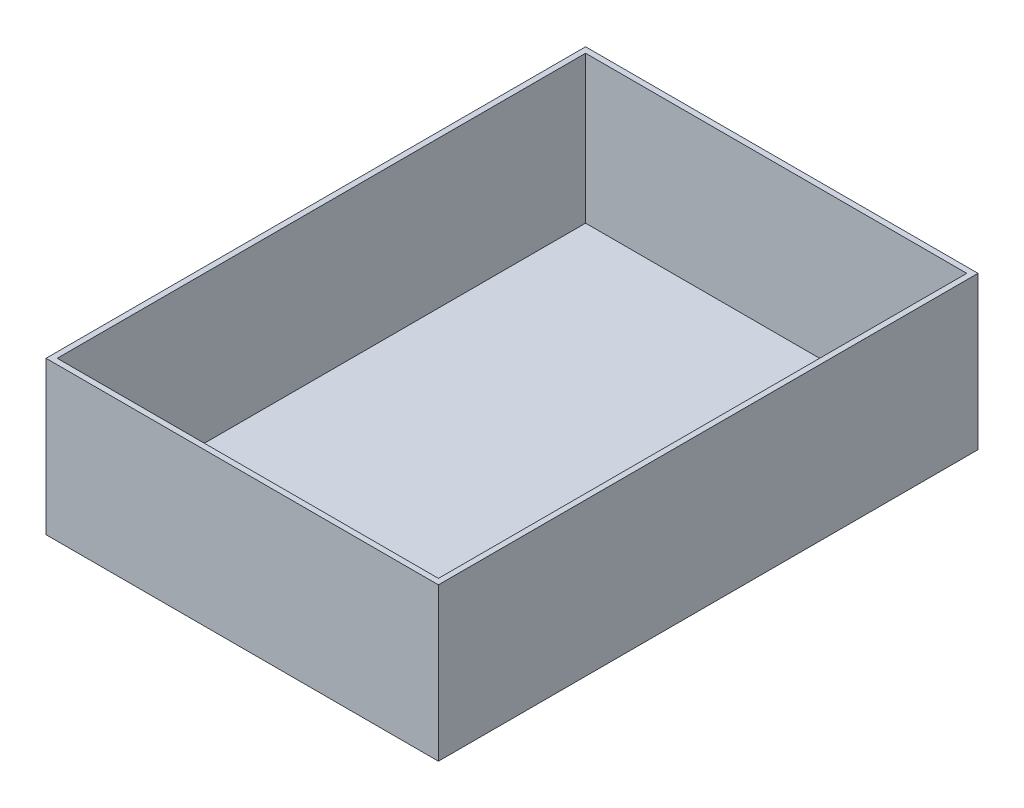
ISO-10303-21;
HEADER;
FILE_DESCRIPTION(('STEP AP214'),'2;1');
FILE_NAME('part.step','',(''),(''),'','','');
FILE_SCHEMA(('AUTOMOTIVE_DESIGN { 1 0 10303 214 1 1 1 1 }'));
ENDSEC;
DATA;
#1=APPLICATION_CONTEXT('core data for automotive mechanical design processes');
#2=APPLICATION_PROTOCOL_DEFINITION('international standard','automotive_design',2000,#1);
#3=PRODUCT_CONTEXT('',#1,'mechanical');
#4=PRODUCT('Part','Part','',(#3));
#5=PRODUCT_RELATED_PRODUCT_CATEGORY('part','',(#4));
#6=PRODUCT_DEFINITION_FORMATION('','',#4);
#7=PRODUCT_DEFINITION_CONTEXT('part definition',#1,'design');
#8=PRODUCT_DEFINITION('design','',#6,#7);
#9=PRODUCT_DEFINITION_SHAPE('','',#8);
#10=(LENGTH_UNIT() NAMED_UNIT(*) SI_UNIT(.MILLI.,.METRE.));
#11=(NAMED_UNIT(*) PLANE_ANGLE_UNIT() SI_UNIT($,.RADIAN.));
#12=(NAMED_UNIT(*) SI_UNIT($,.STERADIAN.) SOLID_ANGLE_UNIT());
#13=UNCERTAINTY_MEASURE_WITH_UNIT(LENGTH_MEASURE(1.E-05),#10,'distance_accuracy_value','');
#14=(GEOMETRIC_REPRESENTATION_CONTEXT(3) GLOBAL_UNCERTAINTY_ASSIGNED_CONTEXT((#13)) GLOBAL_UNIT_ASSIGNED_CONTEXT((#10,
#11,#12)) REPRESENTATION_CONTEXT('',''));
#15=CARTESIAN_POINT('',(0.,0.,0.));
#16=DIRECTION('',(0.,0.,1.));
#17=DIRECTION('',(1.,0.,0.));
#18=AXIS2_PLACEMENT_3D('',#15,#16,#17);
#19=CARTESIAN_POINT('',(0.,21.8,0.));
#20=DIRECTION('',(0.,-1.,0.));
#21=DIRECTION('',(0.,0.,-1.));
#22=AXIS2_PLACEMENT_3D('',#19,#20,#21);
#23=PLANE('',#22);
#24=DIRECTION('',(0.,0.,-1.));
#25=VECTOR('',#24,1.);
#26=CARTESIAN_POINT('',(28.,21.8,38.5));
#27=LINE('',#26,#25);
#28=CARTESIAN_POINT('',(28.,21.8,38.5));
#29=VERTEX_POINT('',#28);
#30=CARTESIAN_POINT('',(28.,21.8,-38.5));
#31=VERTEX_POINT('',#30);
#32=EDGE_CURVE('E159',#29,#31,#27,.T.);
#33=ORIENTED_EDGE('',*,*,#32,.T.);
#34=DIRECTION('',(-1.,0.,0.));
#35=VECTOR('',#34,1.);
#36=CARTESIAN_POINT('',(-28.,21.8,-38.5));
#37=LINE('',#36,#35);
#38=CARTESIAN_POINT('',(-28.,21.8,-38.5));
#39=VERTEX_POINT('',#38);
#40=EDGE_CURVE('E94',#31,#39,#37,.T.);
#41=ORIENTED_EDGE('',*,*,#40,.T.);
#42=DIRECTION('',(0.,0.,1.));
#43=VECTOR('',#42,1.);
#44=CARTESIAN_POINT('',(-28.,21.8,38.5));
#45=LINE('',#44,#43);
#46=CARTESIAN_POINT('',(-28.,21.8,38.5));
#47=VERTEX_POINT('',#46);
#48=EDGE_CURVE('E164',#39,#47,#45,.T.);
#49=ORIENTED_EDGE('',*,*,#48,.T.);
#50=DIRECTION('',(1.,0.,0.));
#51=VECTOR('',#50,1.);
#52=CARTESIAN_POINT('',(-28.,21.8,38.5));
#53=LINE('',#52,#51);
#54=EDGE_CURVE('E66',#47,#29,#53,.T.);
#55=ORIENTED_EDGE('',*,*,#54,.T.);
#56=EDGE_LOOP('',(#33,#41,#49,#55));
#57=FACE_BOUND('',#56,.T.);
#58=DIRECTION('',(0.,0.,-1.));
#59=VECTOR('',#58,1.);
#60=CARTESIAN_POINT('',(27.2,21.8,0.));
#61=LINE('',#60,#59);
#62=CARTESIAN_POINT('',(27.2,21.8,37.7));
#63=VERTEX_POINT('',#62);
#64=CARTESIAN_POINT('',(27.2,21.8,-37.7));
#65=VERTEX_POINT('',#64);
#66=EDGE_CURVE('E143',#63,#65,#61,.T.);
#67=ORIENTED_EDGE('',*,*,#66,.F.);
#68=DIRECTION('',(1.,0.,0.));
#69=VECTOR('',#68,1.);
#70=CARTESIAN_POINT('',(0.,21.8,37.7));
#71=LINE('',#70,#69);
#72=CARTESIAN_POINT('',(-27.2,21.8,37.7));
#73=VERTEX_POINT('',#72);
#74=EDGE_CURVE('E156',#73,#63,#71,.T.);
#75=ORIENTED_EDGE('',*,*,#74,.F.);
#76=DIRECTION('',(0.,0.,1.));
#77=VECTOR('',#76,1.);
#78=CARTESIAN_POINT('',(-27.2,21.8,0.));
#79=LINE('',#78,#77);
#80=CARTESIAN_POINT('',(-27.2,21.8,-37.7));
#81=VERTEX_POINT('',#80);
#82=EDGE_CURVE('E153',#81,#73,#79,.T.);
#83=ORIENTED_EDGE('',*,*,#82,.F.);
#84=DIRECTION('',(-1.,0.,0.));
#85=VECTOR('',#84,1.);
#86=CARTESIAN_POINT('',(0.,21.8,-37.7));
#87=LINE('',#86,#85);
#88=EDGE_CURVE('E132',#65,#81,#87,.T.);
#89=ORIENTED_EDGE('',*,*,#88,.F.);
#90=EDGE_LOOP('',(#67,#75,#83,#89));
#91=FACE_BOUND('',#90,.T.);
#92=ADVANCED_FACE('F41',(#57,#91),#23,.F.);
#93=CARTESIAN_POINT('',(28.,21.8,38.5));
#94=DIRECTION('',(-1.,0.,0.));
#95=DIRECTION('',(0.,0.,1.));
#96=AXIS2_PLACEMENT_3D('',#93,#94,#95);
#97=PLANE('',#96);
#98=DIRECTION('',(0.,0.,-1.));
#99=VECTOR('',#98,1.);
#100=CARTESIAN_POINT('',(28.,0.,38.5));
#101=LINE('',#100,#99);
#102=CARTESIAN_POINT('',(28.,0.,38.5));
#103=VERTEX_POINT('',#102);
#104=CARTESIAN_POINT('',(28.,0.,-38.5));
#105=VERTEX_POINT('',#104);
#106=EDGE_CURVE('E170',#103,#105,#101,.T.);
#107=ORIENTED_EDGE('',*,*,#106,.T.);
#108=DIRECTION('',(0.,-1.,0.));
#109=VECTOR('',#108,1.);
#110=CARTESIAN_POINT('',(28.,21.8,-38.5));
#111=LINE('',#110,#109);
#112=EDGE_CURVE('E11',#31,#105,#111,.T.);
#113=ORIENTED_EDGE('',*,*,#112,.F.);
#114=ORIENTED_EDGE('',*,*,#32,.F.);
#115=DIRECTION('',(0.,-1.,0.));
#116=VECTOR('',#115,1.);
#117=CARTESIAN_POINT('',(28.,21.8,38.5));
#118=LINE('',#117,#116);
#119=EDGE_CURVE('E169',#29,#103,#118,.T.);
#120=ORIENTED_EDGE('',*,*,#119,.T.);
#121=EDGE_LOOP('',(#107,#113,#114,#120));
#122=FACE_BOUND('',#121,.T.);
#123=ADVANCED_FACE('F43',(#122),#97,.F.);
#124=CARTESIAN_POINT('',(-28.,21.8,-38.5));
#125=DIRECTION('',(0.,0.,1.));
#126=DIRECTION('',(1.,0.,0.));
#127=AXIS2_PLACEMENT_3D('',#124,#125,#126);
#128=PLANE('',#127);
#129=DIRECTION('',(-1.,0.,0.));
#130=VECTOR('',#129,1.);
#131=CARTESIAN_POINT('',(-28.,0.,-38.5));
#132=LINE('',#131,#130);
#133=CARTESIAN_POINT('',(-28.,0.,-38.5));
#134=VERTEX_POINT('',#133);
#135=EDGE_CURVE('E174',#105,#134,#132,.T.);
#136=ORIENTED_EDGE('',*,*,#135,.T.);
#137=DIRECTION('',(0.,-1.,0.));
#138=VECTOR('',#137,1.);
#139=CARTESIAN_POINT('',(-28.,21.8,-38.5));
#140=LINE('',#139,#138);
#141=EDGE_CURVE('E50',#39,#134,#140,.T.);
#142=ORIENTED_EDGE('',*,*,#141,.F.);
#143=ORIENTED_EDGE('',*,*,#40,.F.);
#144=ORIENTED_EDGE('',*,*,#112,.T.);
#145=EDGE_LOOP('',(#136,#142,#143,#144));
#146=FACE_BOUND('',#145,.T.);
#147=ADVANCED_FACE('F208',(#146),#128,.F.);
#148=CARTESIAN_POINT('',(-28.,21.8,38.5));
#149=DIRECTION('',(1.,0.,0.));
#150=DIRECTION('',(0.,0.,-1.));
#151=AXIS2_PLACEMENT_3D('',#148,#149,#150);
#152=PLANE('',#151);
#153=DIRECTION('',(0.,0.,1.));
#154=VECTOR('',#153,1.);
#155=CARTESIAN_POINT('',(-28.,0.,38.5));
#156=LINE('',#155,#154);
#157=CARTESIAN_POINT('',(-28.,0.,38.5));
#158=VERTEX_POINT('',#157);
#159=EDGE_CURVE('E177',#134,#158,#156,.T.);
#160=ORIENTED_EDGE('',*,*,#159,.T.);
#161=DIRECTION('',(0.,-1.,0.));
#162=VECTOR('',#161,1.);
#163=CARTESIAN_POINT('',(-28.,21.8,38.5));
#164=LINE('',#163,#162);
#165=EDGE_CURVE('E184',#47,#158,#164,.T.);
#166=ORIENTED_EDGE('',*,*,#165,.F.);
#167=ORIENTED_EDGE('',*,*,#48,.F.);
#168=ORIENTED_EDGE('',*,*,#141,.T.);
#169=EDGE_LOOP('',(#160,#166,#167,#168));
#170=FACE_BOUND('',#169,.T.);
#171=ADVANCED_FACE('F191',(#170),#152,.F.);
#172=CARTESIAN_POINT('',(-28.,21.8,38.5));
#173=DIRECTION('',(0.,0.,-1.));
#174=DIRECTION('',(-1.,0.,0.));
#175=AXIS2_PLACEMENT_3D('',#172,#173,#174);
#176=PLANE('',#175);
#177=DIRECTION('',(1.,0.,0.));
#178=VECTOR('',#177,1.);
#179=CARTESIAN_POINT('',(-28.,0.,38.5));
#180=LINE('',#179,#178);
#181=EDGE_CURVE('E87',#158,#103,#180,.T.);
#182=ORIENTED_EDGE('',*,*,#181,.T.);
#183=ORIENTED_EDGE('',*,*,#119,.F.);
#184=ORIENTED_EDGE('',*,*,#54,.F.);
#185=ORIENTED_EDGE('',*,*,#165,.T.);
#186=EDGE_LOOP('',(#182,#183,#184,#185));
#187=FACE_BOUND('',#186,.T.);
#188=ADVANCED_FACE('F199',(#187),#176,.F.);
#189=CARTESIAN_POINT('',(0.,0.,0.));
#190=DIRECTION('',(0.,-1.,0.));
#191=DIRECTION('',(0.,0.,-1.));
#192=AXIS2_PLACEMENT_3D('',#189,#190,#191);
#193=PLANE('',#192);
#194=ORIENTED_EDGE('',*,*,#106,.F.);
#195=ORIENTED_EDGE('',*,*,#181,.F.);
#196=ORIENTED_EDGE('',*,*,#159,.F.);
#197=ORIENTED_EDGE('',*,*,#135,.F.);
#198=EDGE_LOOP('',(#194,#195,#196,#197));
#199=FACE_BOUND('',#198,.T.);
#200=ADVANCED_FACE('F195',(#199),#193,.T.);
#201=CARTESIAN_POINT('',(27.2,21.8,38.5));
#202=DIRECTION('',(-1.,0.,0.));
#203=DIRECTION('',(0.,0.,1.));
#204=AXIS2_PLACEMENT_3D('',#201,#202,#203);
#205=PLANE('',#204);
#206=DIRECTION('',(0.,0.,-1.));
#207=VECTOR('',#206,1.);
#208=CARTESIAN_POINT('',(27.2,0.8,0.));
#209=LINE('',#208,#207);
#210=CARTESIAN_POINT('',(27.2,0.8,37.7));
#211=VERTEX_POINT('',#210);
#212=CARTESIAN_POINT('',(27.2,0.8,-37.7));
#213=VERTEX_POINT('',#212);
#214=EDGE_CURVE('E122',#211,#213,#209,.T.);
#215=ORIENTED_EDGE('',*,*,#214,.F.);
#216=DIRECTION('',(0.,-1.,0.));
#217=VECTOR('',#216,1.);
#218=CARTESIAN_POINT('',(27.2,21.8,37.7));
#219=LINE('',#218,#217);
#220=EDGE_CURVE('E147',#63,#211,#219,.T.);
#221=ORIENTED_EDGE('',*,*,#220,.F.);
#222=ORIENTED_EDGE('',*,*,#66,.T.);
#223=DIRECTION('',(0.,-1.,0.));
#224=VECTOR('',#223,1.);
#225=CARTESIAN_POINT('',(27.2,21.8,-37.7));
#226=LINE('',#225,#224);
#227=EDGE_CURVE('E136',#65,#213,#226,.T.);
#228=ORIENTED_EDGE('',*,*,#227,.T.);
#229=EDGE_LOOP('',(#215,#221,#222,#228));
#230=FACE_BOUND('',#229,.T.);
#231=ADVANCED_FACE('F206',(#230),#205,.T.);
#232=CARTESIAN_POINT('',(-28.,21.8,-37.7));
#233=DIRECTION('',(0.,0.,1.));
#234=DIRECTION('',(1.,0.,0.));
#235=AXIS2_PLACEMENT_3D('',#232,#233,#234);
#236=PLANE('',#235);
#237=DIRECTION('',(-1.,0.,0.));
#238=VECTOR('',#237,1.);
#239=CARTESIAN_POINT('',(0.,0.8,-37.7));
#240=LINE('',#239,#238);
#241=CARTESIAN_POINT('',(-27.2,0.8,-37.7));
#242=VERTEX_POINT('',#241);
#243=EDGE_CURVE('E116',#213,#242,#240,.T.);
#244=ORIENTED_EDGE('',*,*,#243,.F.);
#245=ORIENTED_EDGE('',*,*,#227,.F.);
#246=ORIENTED_EDGE('',*,*,#88,.T.);
#247=DIRECTION('',(0.,-1.,0.));
#248=VECTOR('',#247,1.);
#249=CARTESIAN_POINT('',(-27.2,21.8,-37.7));
#250=LINE('',#249,#248);
#251=EDGE_CURVE('E129',#81,#242,#250,.T.);
#252=ORIENTED_EDGE('',*,*,#251,.T.);
#253=EDGE_LOOP('',(#244,#245,#246,#252));
#254=FACE_BOUND('',#253,.T.);
#255=ADVANCED_FACE('F130',(#254),#236,.T.);
#256=CARTESIAN_POINT('',(-27.2,21.8,38.5));
#257=DIRECTION('',(1.,0.,0.));
#258=DIRECTION('',(0.,0.,-1.));
#259=AXIS2_PLACEMENT_3D('',#256,#257,#258);
#260=PLANE('',#259);
#261=DIRECTION('',(0.,0.,1.));
#262=VECTOR('',#261,1.);
#263=CARTESIAN_POINT('',(-27.2,0.8,0.));
#264=LINE('',#263,#262);
#265=CARTESIAN_POINT('',(-27.2,0.8,37.7));
#266=VERTEX_POINT('',#265);
#267=EDGE_CURVE('E120',#242,#266,#264,.T.);
#268=ORIENTED_EDGE('',*,*,#267,.F.);
#269=ORIENTED_EDGE('',*,*,#251,.F.);
#270=ORIENTED_EDGE('',*,*,#82,.T.);
#271=DIRECTION('',(0.,-1.,0.));
#272=VECTOR('',#271,1.);
#273=CARTESIAN_POINT('',(-27.2,21.8,37.7));
#274=LINE('',#273,#272);
#275=EDGE_CURVE('E57',#73,#266,#274,.T.);
#276=ORIENTED_EDGE('',*,*,#275,.T.);
#277=EDGE_LOOP('',(#268,#269,#270,#276));
#278=FACE_BOUND('',#277,.T.);
#279=ADVANCED_FACE('F138',(#278),#260,.T.);
#280=CARTESIAN_POINT('',(-28.,21.8,37.7));
#281=DIRECTION('',(0.,0.,-1.));
#282=DIRECTION('',(-1.,0.,0.));
#283=AXIS2_PLACEMENT_3D('',#280,#281,#282);
#284=PLANE('',#283);
#285=DIRECTION('',(1.,0.,0.));
#286=VECTOR('',#285,1.);
#287=CARTESIAN_POINT('',(0.,0.8,37.7));
#288=LINE('',#287,#286);
#289=EDGE_CURVE('E140',#266,#211,#288,.T.);
#290=ORIENTED_EDGE('',*,*,#289,.F.);
#291=ORIENTED_EDGE('',*,*,#275,.F.);
#292=ORIENTED_EDGE('',*,*,#74,.T.);
#293=ORIENTED_EDGE('',*,*,#220,.T.);
#294=EDGE_LOOP('',(#290,#291,#292,#293));
#295=FACE_BOUND('',#294,.T.);
#296=ADVANCED_FACE('F219',(#295),#284,.T.);
#297=CARTESIAN_POINT('',(0.,0.8,0.));
#298=DIRECTION('',(0.,-1.,0.));
#299=DIRECTION('',(0.,0.,-1.));
#300=AXIS2_PLACEMENT_3D('',#297,#298,#299);
#301=PLANE('',#300);
#302=ORIENTED_EDGE('',*,*,#214,.T.);
#303=ORIENTED_EDGE('',*,*,#243,.T.);
#304=ORIENTED_EDGE('',*,*,#267,.T.);
#305=ORIENTED_EDGE('',*,*,#289,.T.);
#306=EDGE_LOOP('',(#302,#303,#304,#305));
#307=FACE_BOUND('',#306,.T.);
#308=ADVANCED_FACE('F118',(#307),#301,.F.);
#309=CLOSED_SHELL('',(#92,#123,#147,#171,#188,#200,#231,#255,#279,#296,#308));
#310=MANIFOLD_SOLID_BREP('B2',#309);
#311=ADVANCED_BREP_SHAPE_REPRESENTATION('',(#18,#310),#14);
#312=SHAPE_DEFINITION_REPRESENTATION(#9,#311);
ENDSEC;
END-ISO-10303-21;
